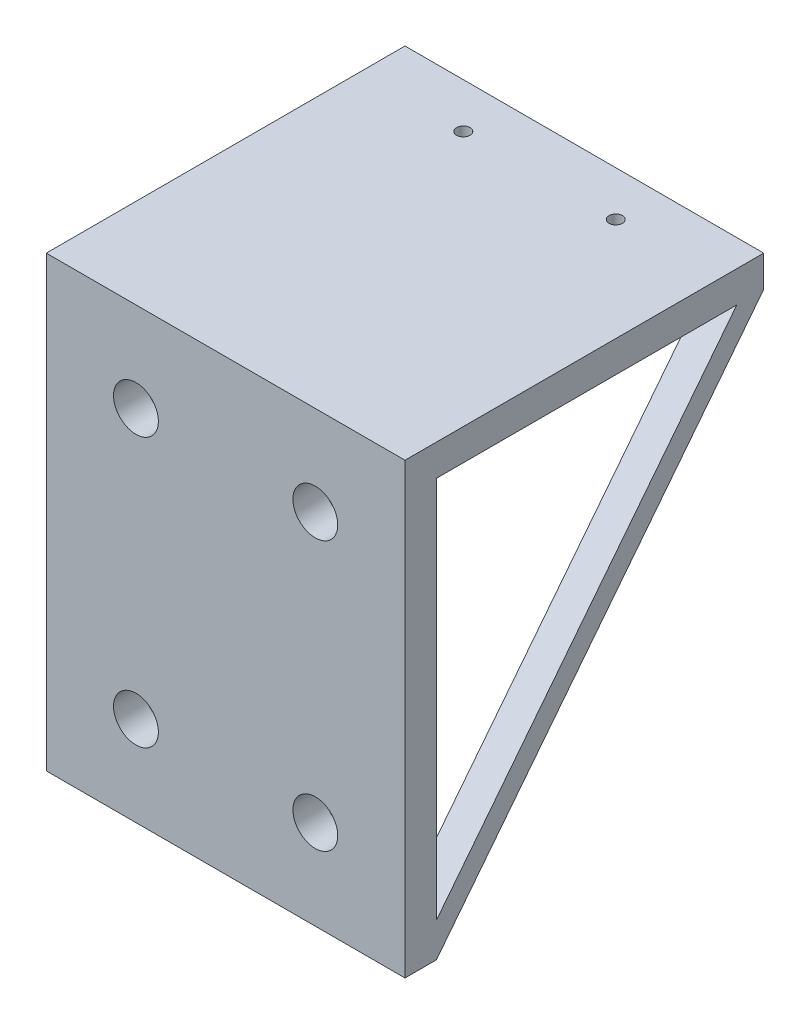
ISO-10303-21;
HEADER;
FILE_DESCRIPTION(('STEP AP214'),'2;1');
FILE_NAME('part.step','',(''),(''),'','','');
FILE_SCHEMA(('AUTOMOTIVE_DESIGN { 1 0 10303 214 1 1 1 1 }'));
ENDSEC;
DATA;
#1=APPLICATION_CONTEXT('core data for automotive mechanical design processes');
#2=APPLICATION_PROTOCOL_DEFINITION('international standard','automotive_design',2000,#1);
#3=PRODUCT_CONTEXT('',#1,'mechanical');
#4=PRODUCT('Part','Part','',(#3));
#5=PRODUCT_RELATED_PRODUCT_CATEGORY('part','',(#4));
#6=PRODUCT_DEFINITION_FORMATION('','',#4);
#7=PRODUCT_DEFINITION_CONTEXT('part definition',#1,'design');
#8=PRODUCT_DEFINITION('design','',#6,#7);
#9=PRODUCT_DEFINITION_SHAPE('','',#8);
#10=(LENGTH_UNIT() NAMED_UNIT(*) SI_UNIT(.MILLI.,.METRE.));
#11=(NAMED_UNIT(*) PLANE_ANGLE_UNIT() SI_UNIT($,.RADIAN.));
#12=(NAMED_UNIT(*) SI_UNIT($,.STERADIAN.) SOLID_ANGLE_UNIT());
#13=UNCERTAINTY_MEASURE_WITH_UNIT(LENGTH_MEASURE(1.E-05),#10,'distance_accuracy_value','');
#14=(GEOMETRIC_REPRESENTATION_CONTEXT(3) GLOBAL_UNCERTAINTY_ASSIGNED_CONTEXT((#13)) GLOBAL_UNIT_ASSIGNED_CONTEXT((#10,
#11,#12)) REPRESENTATION_CONTEXT('',''));
#15=CARTESIAN_POINT('',(0.,0.,0.));
#16=DIRECTION('',(0.,0.,1.));
#17=DIRECTION('',(1.,0.,0.));
#18=AXIS2_PLACEMENT_3D('',#15,#16,#17);
#19=CARTESIAN_POINT('',(0.,0.,0.));
#20=DIRECTION('',(0.,0.,1.));
#21=DIRECTION('',(1.,0.,0.));
#22=AXIS2_PLACEMENT_3D('',#19,#20,#21);
#23=PLANE('',#22);
#24=CARTESIAN_POINT('',(20.,30.,0.));
#25=DIRECTION('',(0.,0.,-1.));
#26=DIRECTION('',(-1.,0.,0.));
#27=AXIS2_PLACEMENT_3D('',#24,#25,#26);
#28=CIRCLE('',#27,5.);
#29=CARTESIAN_POINT('',(15.,30.,0.));
#30=VERTEX_POINT('',#29);
#31=EDGE_CURVE('E205',#30,#30,#28,.T.);
#32=ORIENTED_EDGE('',*,*,#31,.F.);
#33=EDGE_LOOP('',(#32));
#34=FACE_BOUND('',#33,.T.);
#35=CARTESIAN_POINT('',(-20.,30.,0.));
#36=DIRECTION('',(0.,0.,-1.));
#37=DIRECTION('',(1.,0.,0.));
#38=AXIS2_PLACEMENT_3D('',#35,#36,#37);
#39=CIRCLE('',#38,5.);
#40=CARTESIAN_POINT('',(-25.,30.,0.));
#41=VERTEX_POINT('',#40);
#42=EDGE_CURVE('E206',#41,#41,#39,.T.);
#43=ORIENTED_EDGE('',*,*,#42,.F.);
#44=EDGE_LOOP('',(#43));
#45=FACE_BOUND('',#44,.T.);
#46=CARTESIAN_POINT('',(-20.,-30.,0.));
#47=DIRECTION('',(0.,0.,-1.));
#48=DIRECTION('',(-1.,0.,0.));
#49=AXIS2_PLACEMENT_3D('',#46,#47,#48);
#50=CIRCLE('',#49,5.);
#51=CARTESIAN_POINT('',(-25.,-30.,0.));
#52=VERTEX_POINT('',#51);
#53=EDGE_CURVE('E212',#52,#52,#50,.T.);
#54=ORIENTED_EDGE('',*,*,#53,.F.);
#55=EDGE_LOOP('',(#54));
#56=FACE_BOUND('',#55,.T.);
#57=CARTESIAN_POINT('',(20.,-30.,0.));
#58=DIRECTION('',(0.,0.,-1.));
#59=DIRECTION('',(1.,0.,0.));
#60=AXIS2_PLACEMENT_3D('',#57,#58,#59);
#61=CIRCLE('',#60,5.);
#62=CARTESIAN_POINT('',(15.,-30.,0.));
#63=VERTEX_POINT('',#62);
#64=EDGE_CURVE('E199',#63,#63,#61,.T.);
#65=ORIENTED_EDGE('',*,*,#64,.F.);
#66=EDGE_LOOP('',(#65));
#67=FACE_BOUND('',#66,.T.);
#68=DIRECTION('',(1.,0.,0.));
#69=VECTOR('',#68,1.);
#70=CARTESIAN_POINT('',(0.,-42.3561643835616,0.));
#71=LINE('',#70,#69);
#72=CARTESIAN_POINT('',(-40.,-42.3561643835616,0.));
#73=VERTEX_POINT('',#72);
#74=CARTESIAN_POINT('',(-33.,-42.3561643835616,0.));
#75=VERTEX_POINT('',#74);
#76=EDGE_CURVE('E145',#73,#75,#71,.T.);
#77=ORIENTED_EDGE('',*,*,#76,.F.);
#78=DIRECTION('',(0.,-1.,0.));
#79=VECTOR('',#78,1.);
#80=CARTESIAN_POINT('',(-40.,-50.,0.));
#81=LINE('',#80,#79);
#82=CARTESIAN_POINT('',(-40.,43.,0.));
#83=VERTEX_POINT('',#82);
#84=EDGE_CURVE('E223',#83,#73,#81,.T.);
#85=ORIENTED_EDGE('',*,*,#84,.F.);
#86=DIRECTION('',(1.,0.,0.));
#87=VECTOR('',#86,1.);
#88=CARTESIAN_POINT('',(0.,43.,0.));
#89=LINE('',#88,#87);
#90=CARTESIAN_POINT('',(40.,43.,0.));
#91=VERTEX_POINT('',#90);
#92=EDGE_CURVE('E11',#83,#91,#89,.T.);
#93=ORIENTED_EDGE('',*,*,#92,.T.);
#94=DIRECTION('',(0.,1.,0.));
#95=VECTOR('',#94,1.);
#96=CARTESIAN_POINT('',(40.,-50.,0.));
#97=LINE('',#96,#95);
#98=CARTESIAN_POINT('',(40.,-42.3561643835616,0.));
#99=VERTEX_POINT('',#98);
#100=EDGE_CURVE('E229',#99,#91,#97,.T.);
#101=ORIENTED_EDGE('',*,*,#100,.F.);
#102=DIRECTION('',(-1.,0.,0.));
#103=VECTOR('',#102,1.);
#104=CARTESIAN_POINT('',(0.,-42.3561643835616,0.));
#105=LINE('',#104,#103);
#106=CARTESIAN_POINT('',(33.,-42.3561643835616,0.));
#107=VERTEX_POINT('',#106);
#108=EDGE_CURVE('E182',#99,#107,#105,.T.);
#109=ORIENTED_EDGE('',*,*,#108,.T.);
#110=DIRECTION('',(0.,-1.,0.));
#111=VECTOR('',#110,1.);
#112=CARTESIAN_POINT('',(33.,0.,0.));
#113=LINE('',#112,#111);
#114=CARTESIAN_POINT('',(33.,-50.,0.));
#115=VERTEX_POINT('',#114);
#116=EDGE_CURVE('E177',#107,#115,#113,.T.);
#117=ORIENTED_EDGE('',*,*,#116,.T.);
#118=DIRECTION('',(1.,0.,0.));
#119=VECTOR('',#118,1.);
#120=CARTESIAN_POINT('',(40.,-50.,0.));
#121=LINE('',#120,#119);
#122=CARTESIAN_POINT('',(-33.,-50.,0.));
#123=VERTEX_POINT('',#122);
#124=EDGE_CURVE('E238',#123,#115,#121,.T.);
#125=ORIENTED_EDGE('',*,*,#124,.F.);
#126=DIRECTION('',(0.,1.,0.));
#127=VECTOR('',#126,1.);
#128=CARTESIAN_POINT('',(-33.,0.,0.));
#129=LINE('',#128,#127);
#130=EDGE_CURVE('E155',#123,#75,#129,.T.);
#131=ORIENTED_EDGE('',*,*,#130,.T.);
#132=EDGE_LOOP('',(#77,#85,#93,#101,#109,#117,#125,#131));
#133=FACE_BOUND('',#132,.T.);
#134=ADVANCED_FACE('F37',(#34,#45,#56,#67,#133),#23,.F.);
#135=CARTESIAN_POINT('',(0.,43.,0.));
#136=DIRECTION('',(0.,-1.,0.));
#137=DIRECTION('',(1.,0.,0.));
#138=AXIS2_PLACEMENT_3D('',#135,#136,#137);
#139=PLANE('',#138);
#140=CARTESIAN_POINT('',(-17.,43.,-63.));
#141=DIRECTION('',(0.,1.,0.));
#142=DIRECTION('',(-1.,0.,0.));
#143=AXIS2_PLACEMENT_3D('',#140,#141,#142);
#144=CIRCLE('',#143,1.5);
#145=CARTESIAN_POINT('',(-18.5,43.,-63.));
#146=VERTEX_POINT('',#145);
#147=EDGE_CURVE('E261',#146,#146,#144,.T.);
#148=ORIENTED_EDGE('',*,*,#147,.T.);
#149=EDGE_LOOP('',(#148));
#150=FACE_BOUND('',#149,.T.);
#151=CARTESIAN_POINT('',(17.,43.,-63.));
#152=DIRECTION('',(0.,1.,0.));
#153=DIRECTION('',(-1.,0.,0.));
#154=AXIS2_PLACEMENT_3D('',#151,#152,#153);
#155=CIRCLE('',#154,1.5);
#156=CARTESIAN_POINT('',(15.5,43.,-63.));
#157=VERTEX_POINT('',#156);
#158=EDGE_CURVE('E267',#157,#157,#155,.T.);
#159=ORIENTED_EDGE('',*,*,#158,.T.);
#160=EDGE_LOOP('',(#159));
#161=FACE_BOUND('',#160,.T.);
#162=DIRECTION('',(0.,0.,1.));
#163=VECTOR('',#162,1.);
#164=CARTESIAN_POINT('',(-40.,43.,7.));
#165=LINE('',#164,#163);
#166=CARTESIAN_POINT('',(-40.,43.,-67.));
#167=VERTEX_POINT('',#166);
#168=EDGE_CURVE('E151',#167,#83,#165,.T.);
#169=ORIENTED_EDGE('',*,*,#168,.F.);
#170=DIRECTION('',(-1.,0.,0.));
#171=VECTOR('',#170,1.);
#172=CARTESIAN_POINT('',(-33.,43.,-67.));
#173=LINE('',#172,#171);
#174=CARTESIAN_POINT('',(-33.,43.,-67.));
#175=VERTEX_POINT('',#174);
#176=EDGE_CURVE('E142',#175,#167,#173,.T.);
#177=ORIENTED_EDGE('',*,*,#176,.F.);
#178=DIRECTION('',(0.,0.,1.));
#179=VECTOR('',#178,1.);
#180=CARTESIAN_POINT('',(-33.,43.,-73.));
#181=LINE('',#180,#179);
#182=CARTESIAN_POINT('',(-33.,43.,-73.));
#183=VERTEX_POINT('',#182);
#184=EDGE_CURVE('E127',#183,#175,#181,.T.);
#185=ORIENTED_EDGE('',*,*,#184,.F.);
#186=DIRECTION('',(-1.,0.,0.));
#187=VECTOR('',#186,1.);
#188=CARTESIAN_POINT('',(-40.,43.,-73.));
#189=LINE('',#188,#187);
#190=CARTESIAN_POINT('',(33.,43.,-73.));
#191=VERTEX_POINT('',#190);
#192=EDGE_CURVE('E189',#191,#183,#189,.T.);
#193=ORIENTED_EDGE('',*,*,#192,.F.);
#194=DIRECTION('',(0.,0.,1.));
#195=VECTOR('',#194,1.);
#196=CARTESIAN_POINT('',(33.,43.,-73.));
#197=LINE('',#196,#195);
#198=CARTESIAN_POINT('',(33.,43.,-67.));
#199=VERTEX_POINT('',#198);
#200=EDGE_CURVE('E164',#191,#199,#197,.T.);
#201=ORIENTED_EDGE('',*,*,#200,.T.);
#202=DIRECTION('',(1.,0.,0.));
#203=VECTOR('',#202,1.);
#204=CARTESIAN_POINT('',(33.,43.,-67.));
#205=LINE('',#204,#203);
#206=CARTESIAN_POINT('',(40.,43.,-67.));
#207=VERTEX_POINT('',#206);
#208=EDGE_CURVE('E174',#199,#207,#205,.T.);
#209=ORIENTED_EDGE('',*,*,#208,.T.);
#210=DIRECTION('',(0.,0.,-1.));
#211=VECTOR('',#210,1.);
#212=CARTESIAN_POINT('',(40.,43.,7.));
#213=LINE('',#212,#211);
#214=EDGE_CURVE('E187',#91,#207,#213,.T.);
#215=ORIENTED_EDGE('',*,*,#214,.F.);
#216=ORIENTED_EDGE('',*,*,#92,.F.);
#217=EDGE_LOOP('',(#169,#177,#185,#193,#201,#209,#215,#216));
#218=FACE_BOUND('',#217,.T.);
#219=ADVANCED_FACE('F149',(#150,#161,#218),#139,.T.);
#220=CARTESIAN_POINT('',(-40.,-50.,7.));
#221=DIRECTION('',(1.,0.,0.));
#222=DIRECTION('',(0.,0.,-1.));
#223=AXIS2_PLACEMENT_3D('',#220,#221,#222);
#224=PLANE('',#223);
#225=ORIENTED_EDGE('',*,*,#84,.T.);
#226=DIRECTION('',(0.,-0.786611751985509,0.617447934354217));
#227=VECTOR('',#226,1.);
#228=CARTESIAN_POINT('',(-40.,-50.,6.));
#229=LINE('',#228,#227);
#230=EDGE_CURVE('E260',#167,#73,#229,.T.);
#231=ORIENTED_EDGE('',*,*,#230,.F.);
#232=ORIENTED_EDGE('',*,*,#168,.T.);
#233=EDGE_LOOP('',(#225,#231,#232));
#234=FACE_BOUND('',#233,.T.);
#235=DIRECTION('',(0.,0.786611751985509,-0.617447934354217));
#236=VECTOR('',#235,1.);
#237=CARTESIAN_POINT('',(-40.,-50.,0.));
#238=LINE('',#237,#236);
#239=CARTESIAN_POINT('',(-40.,-50.,0.));
#240=VERTEX_POINT('',#239);
#241=CARTESIAN_POINT('',(-40.,43.,-73.));
#242=VERTEX_POINT('',#241);
#243=EDGE_CURVE('E146',#240,#242,#238,.T.);
#244=ORIENTED_EDGE('',*,*,#243,.F.);
#245=DIRECTION('',(0.,0.,-1.));
#246=VECTOR('',#245,1.);
#247=CARTESIAN_POINT('',(-40.,-50.,7.));
#248=LINE('',#247,#246);
#249=CARTESIAN_POINT('',(-40.,-50.,7.));
#250=VERTEX_POINT('',#249);
#251=EDGE_CURVE('E45',#250,#240,#248,.T.);
#252=ORIENTED_EDGE('',*,*,#251,.F.);
#253=DIRECTION('',(0.,-1.,0.));
#254=VECTOR('',#253,1.);
#255=CARTESIAN_POINT('',(-40.,-50.,7.));
#256=LINE('',#255,#254);
#257=CARTESIAN_POINT('',(-40.,50.,7.));
#258=VERTEX_POINT('',#257);
#259=EDGE_CURVE('E226',#258,#250,#256,.T.);
#260=ORIENTED_EDGE('',*,*,#259,.F.);
#261=DIRECTION('',(0.,0.,-1.));
#262=VECTOR('',#261,1.);
#263=CARTESIAN_POINT('',(-40.,50.,7.));
#264=LINE('',#263,#262);
#265=CARTESIAN_POINT('',(-40.,50.,-73.));
#266=VERTEX_POINT('',#265);
#267=EDGE_CURVE('E235',#258,#266,#264,.T.);
#268=ORIENTED_EDGE('',*,*,#267,.T.);
#269=DIRECTION('',(0.,1.,0.));
#270=VECTOR('',#269,1.);
#271=CARTESIAN_POINT('',(-40.,43.,-73.));
#272=LINE('',#271,#270);
#273=EDGE_CURVE('E196',#242,#266,#272,.T.);
#274=ORIENTED_EDGE('',*,*,#273,.F.);
#275=EDGE_LOOP('',(#244,#252,#260,#268,#274));
#276=FACE_BOUND('',#275,.T.);
#277=ADVANCED_FACE('F39',(#234,#276),#224,.F.);
#278=CARTESIAN_POINT('',(40.,-50.,7.));
#279=DIRECTION('',(0.,1.,0.));
#280=DIRECTION('',(-1.,0.,0.));
#281=AXIS2_PLACEMENT_3D('',#278,#279,#280);
#282=PLANE('',#281);
#283=ORIENTED_EDGE('',*,*,#251,.T.);
#284=EDGE_CURVE('E239',#240,#123,#121,.T.);
#285=ORIENTED_EDGE('',*,*,#284,.T.);
#286=ORIENTED_EDGE('',*,*,#124,.T.);
#287=DIRECTION('',(1.,0.,0.));
#288=VECTOR('',#287,1.);
#289=CARTESIAN_POINT('',(33.,-50.,0.));
#290=LINE('',#289,#288);
#291=CARTESIAN_POINT('',(40.,-50.,0.));
#292=VERTEX_POINT('',#291);
#293=EDGE_CURVE('E170',#115,#292,#290,.T.);
#294=ORIENTED_EDGE('',*,*,#293,.T.);
#295=DIRECTION('',(0.,0.,-1.));
#296=VECTOR('',#295,1.);
#297=CARTESIAN_POINT('',(40.,-50.,7.));
#298=LINE('',#297,#296);
#299=CARTESIAN_POINT('',(40.,-50.,7.));
#300=VERTEX_POINT('',#299);
#301=EDGE_CURVE('E246',#300,#292,#298,.T.);
#302=ORIENTED_EDGE('',*,*,#301,.F.);
#303=DIRECTION('',(1.,0.,0.));
#304=VECTOR('',#303,1.);
#305=CARTESIAN_POINT('',(40.,-50.,7.));
#306=LINE('',#305,#304);
#307=EDGE_CURVE('E228',#250,#300,#306,.T.);
#308=ORIENTED_EDGE('',*,*,#307,.F.);
#309=EDGE_LOOP('',(#283,#285,#286,#294,#302,#308));
#310=FACE_BOUND('',#309,.T.);
#311=ADVANCED_FACE('F251',(#310),#282,.F.);
#312=CARTESIAN_POINT('',(40.,-50.,7.));
#313=DIRECTION('',(-1.,0.,0.));
#314=DIRECTION('',(0.,0.,1.));
#315=AXIS2_PLACEMENT_3D('',#312,#313,#314);
#316=PLANE('',#315);
#317=DIRECTION('',(0.,-0.786611751985509,0.617447934354217));
#318=VECTOR('',#317,1.);
#319=CARTESIAN_POINT('',(40.,-50.,6.));
#320=LINE('',#319,#318);
#321=EDGE_CURVE('E52',#207,#99,#320,.T.);
#322=ORIENTED_EDGE('',*,*,#321,.T.);
#323=ORIENTED_EDGE('',*,*,#100,.T.);
#324=ORIENTED_EDGE('',*,*,#214,.T.);
#325=EDGE_LOOP('',(#322,#323,#324));
#326=FACE_BOUND('',#325,.T.);
#327=ORIENTED_EDGE('',*,*,#301,.T.);
#328=DIRECTION('',(0.,0.786611751985509,-0.617447934354217));
#329=VECTOR('',#328,1.);
#330=CARTESIAN_POINT('',(40.,-50.,0.));
#331=LINE('',#330,#329);
#332=CARTESIAN_POINT('',(40.,43.,-73.));
#333=VERTEX_POINT('',#332);
#334=EDGE_CURVE('E162',#292,#333,#331,.T.);
#335=ORIENTED_EDGE('',*,*,#334,.T.);
#336=DIRECTION('',(0.,1.,0.));
#337=VECTOR('',#336,1.);
#338=CARTESIAN_POINT('',(40.,43.,-73.));
#339=LINE('',#338,#337);
#340=CARTESIAN_POINT('',(40.,50.,-73.));
#341=VERTEX_POINT('',#340);
#342=EDGE_CURVE('E193',#333,#341,#339,.T.);
#343=ORIENTED_EDGE('',*,*,#342,.T.);
#344=DIRECTION('',(0.,0.,-1.));
#345=VECTOR('',#344,1.);
#346=CARTESIAN_POINT('',(40.,50.,7.));
#347=LINE('',#346,#345);
#348=CARTESIAN_POINT('',(40.,50.,7.));
#349=VERTEX_POINT('',#348);
#350=EDGE_CURVE('E244',#349,#341,#347,.T.);
#351=ORIENTED_EDGE('',*,*,#350,.F.);
#352=DIRECTION('',(0.,1.,0.));
#353=VECTOR('',#352,1.);
#354=CARTESIAN_POINT('',(40.,-50.,7.));
#355=LINE('',#354,#353);
#356=EDGE_CURVE('E231',#300,#349,#355,.T.);
#357=ORIENTED_EDGE('',*,*,#356,.F.);
#358=EDGE_LOOP('',(#327,#335,#343,#351,#357));
#359=FACE_BOUND('',#358,.T.);
#360=ADVANCED_FACE('F289',(#326,#359),#316,.F.);
#361=CARTESIAN_POINT('',(40.,50.,7.));
#362=DIRECTION('',(0.,-1.,0.));
#363=DIRECTION('',(1.,0.,0.));
#364=AXIS2_PLACEMENT_3D('',#361,#362,#363);
#365=PLANE('',#364);
#366=CARTESIAN_POINT('',(-17.,50.,-63.));
#367=DIRECTION('',(0.,1.,0.));
#368=DIRECTION('',(-1.,0.,0.));
#369=AXIS2_PLACEMENT_3D('',#366,#367,#368);
#370=CIRCLE('',#369,1.5);
#371=CARTESIAN_POINT('',(-18.5,50.,-63.));
#372=VERTEX_POINT('',#371);
#373=EDGE_CURVE('E270',#372,#372,#370,.T.);
#374=ORIENTED_EDGE('',*,*,#373,.F.);
#375=EDGE_LOOP('',(#374));
#376=FACE_BOUND('',#375,.T.);
#377=CARTESIAN_POINT('',(17.,50.,-63.));
#378=DIRECTION('',(0.,1.,0.));
#379=DIRECTION('',(-1.,0.,0.));
#380=AXIS2_PLACEMENT_3D('',#377,#378,#379);
#381=CIRCLE('',#380,1.5);
#382=CARTESIAN_POINT('',(15.5,50.,-63.));
#383=VERTEX_POINT('',#382);
#384=EDGE_CURVE('E264',#383,#383,#381,.T.);
#385=ORIENTED_EDGE('',*,*,#384,.F.);
#386=EDGE_LOOP('',(#385));
#387=FACE_BOUND('',#386,.T.);
#388=ORIENTED_EDGE('',*,*,#350,.T.);
#389=DIRECTION('',(-1.,0.,0.));
#390=VECTOR('',#389,1.);
#391=CARTESIAN_POINT('',(-40.,50.,-73.));
#392=LINE('',#391,#390);
#393=EDGE_CURVE('E185',#341,#266,#392,.T.);
#394=ORIENTED_EDGE('',*,*,#393,.T.);
#395=ORIENTED_EDGE('',*,*,#267,.F.);
#396=DIRECTION('',(-1.,0.,0.));
#397=VECTOR('',#396,1.);
#398=CARTESIAN_POINT('',(40.,50.,7.));
#399=LINE('',#398,#397);
#400=EDGE_CURVE('E233',#349,#258,#399,.T.);
#401=ORIENTED_EDGE('',*,*,#400,.F.);
#402=EDGE_LOOP('',(#388,#394,#395,#401));
#403=FACE_BOUND('',#402,.T.);
#404=ADVANCED_FACE('F285',(#376,#387,#403),#365,.F.);
#405=CARTESIAN_POINT('',(0.,0.,7.));
#406=DIRECTION('',(0.,0.,1.));
#407=DIRECTION('',(1.,0.,0.));
#408=AXIS2_PLACEMENT_3D('',#405,#406,#407);
#409=PLANE('',#408);
#410=ORIENTED_EDGE('',*,*,#356,.T.);
#411=ORIENTED_EDGE('',*,*,#400,.T.);
#412=ORIENTED_EDGE('',*,*,#259,.T.);
#413=ORIENTED_EDGE('',*,*,#307,.T.);
#414=EDGE_LOOP('',(#410,#411,#412,#413));
#415=FACE_BOUND('',#414,.T.);
#416=CARTESIAN_POINT('',(20.,-30.,7.));
#417=DIRECTION('',(0.,0.,-1.));
#418=DIRECTION('',(1.,0.,0.));
#419=AXIS2_PLACEMENT_3D('',#416,#417,#418);
#420=CIRCLE('',#419,5.);
#421=CARTESIAN_POINT('',(15.,-30.,7.));
#422=VERTEX_POINT('',#421);
#423=EDGE_CURVE('E215',#422,#422,#420,.T.);
#424=ORIENTED_EDGE('',*,*,#423,.T.);
#425=EDGE_LOOP('',(#424));
#426=FACE_BOUND('',#425,.T.);
#427=CARTESIAN_POINT('',(-20.,-30.,7.));
#428=DIRECTION('',(0.,0.,-1.));
#429=DIRECTION('',(-1.,0.,0.));
#430=AXIS2_PLACEMENT_3D('',#427,#428,#429);
#431=CIRCLE('',#430,5.);
#432=CARTESIAN_POINT('',(-25.,-30.,7.));
#433=VERTEX_POINT('',#432);
#434=EDGE_CURVE('E209',#433,#433,#431,.T.);
#435=ORIENTED_EDGE('',*,*,#434,.T.);
#436=EDGE_LOOP('',(#435));
#437=FACE_BOUND('',#436,.T.);
#438=CARTESIAN_POINT('',(-20.,30.,7.));
#439=DIRECTION('',(0.,0.,-1.));
#440=DIRECTION('',(1.,0.,0.));
#441=AXIS2_PLACEMENT_3D('',#438,#439,#440);
#442=CIRCLE('',#441,5.);
#443=CARTESIAN_POINT('',(-25.,30.,7.));
#444=VERTEX_POINT('',#443);
#445=EDGE_CURVE('E202',#444,#444,#442,.T.);
#446=ORIENTED_EDGE('',*,*,#445,.T.);
#447=EDGE_LOOP('',(#446));
#448=FACE_BOUND('',#447,.T.);
#449=CARTESIAN_POINT('',(20.,30.,7.));
#450=DIRECTION('',(0.,0.,-1.));
#451=DIRECTION('',(-1.,0.,0.));
#452=AXIS2_PLACEMENT_3D('',#449,#450,#451);
#453=CIRCLE('',#452,5.);
#454=CARTESIAN_POINT('',(15.,30.,7.));
#455=VERTEX_POINT('',#454);
#456=EDGE_CURVE('E220',#455,#455,#453,.T.);
#457=ORIENTED_EDGE('',*,*,#456,.T.);
#458=EDGE_LOOP('',(#457));
#459=FACE_BOUND('',#458,.T.);
#460=ADVANCED_FACE('F288',(#415,#426,#437,#448,#459),#409,.T.);
#461=CARTESIAN_POINT('',(20.,30.,7.));
#462=DIRECTION('',(0.,0.,-1.));
#463=DIRECTION('',(-1.,0.,0.));
#464=AXIS2_PLACEMENT_3D('',#461,#462,#463);
#465=CYLINDRICAL_SURFACE('',#464,5.);
#466=CARTESIAN_POINT('',(15.,30.,7.));
#467=CARTESIAN_POINT('',(15.,30.,6.92708333333333));
#468=CARTESIAN_POINT('',(15.,30.,6.85416666666667));
#469=CARTESIAN_POINT('',(15.,30.,6.70833333333333));
#470=CARTESIAN_POINT('',(15.,30.,6.63541666666667));
#471=CARTESIAN_POINT('',(15.,30.,6.48958333333333));
#472=CARTESIAN_POINT('',(15.,30.,6.41666666666667));
#473=CARTESIAN_POINT('',(15.,30.,6.27083333333333));
#474=CARTESIAN_POINT('',(15.,30.,6.19791666666667));
#475=CARTESIAN_POINT('',(15.,30.,6.05208333333333));
#476=CARTESIAN_POINT('',(15.,30.,5.97916666666667));
#477=CARTESIAN_POINT('',(15.,30.,5.83333333333333));
#478=CARTESIAN_POINT('',(15.,30.,5.76041666666667));
#479=CARTESIAN_POINT('',(15.,30.,5.61458333333333));
#480=CARTESIAN_POINT('',(15.,30.,5.54166666666667));
#481=CARTESIAN_POINT('',(15.,30.,5.39583333333333));
#482=CARTESIAN_POINT('',(15.,30.,5.32291666666667));
#483=CARTESIAN_POINT('',(15.,30.,5.17708333333333));
#484=CARTESIAN_POINT('',(15.,30.,5.10416666666667));
#485=CARTESIAN_POINT('',(15.,30.,4.95833333333333));
#486=CARTESIAN_POINT('',(15.,30.,4.88541666666667));
#487=CARTESIAN_POINT('',(15.,30.,4.73958333333333));
#488=CARTESIAN_POINT('',(15.,30.,4.66666666666667));
#489=CARTESIAN_POINT('',(15.,30.,4.52083333333333));
#490=CARTESIAN_POINT('',(15.,30.,4.44791666666667));
#491=CARTESIAN_POINT('',(15.,30.,4.30208333333333));
#492=CARTESIAN_POINT('',(15.,30.,4.22916666666667));
#493=CARTESIAN_POINT('',(15.,30.,4.08333333333333));
#494=CARTESIAN_POINT('',(15.,30.,4.01041666666667));
#495=CARTESIAN_POINT('',(15.,30.,3.86458333333333));
#496=CARTESIAN_POINT('',(15.,30.,3.79166666666667));
#497=CARTESIAN_POINT('',(15.,30.,3.64583333333333));
#498=CARTESIAN_POINT('',(15.,30.,3.57291666666667));
#499=CARTESIAN_POINT('',(15.,30.,3.42708333333333));
#500=CARTESIAN_POINT('',(15.,30.,3.35416666666667));
#501=CARTESIAN_POINT('',(15.,30.,3.20833333333333));
#502=CARTESIAN_POINT('',(15.,30.,3.13541666666667));
#503=CARTESIAN_POINT('',(15.,30.,2.98958333333333));
#504=CARTESIAN_POINT('',(15.,30.,2.91666666666667));
#505=CARTESIAN_POINT('',(15.,30.,2.77083333333333));
#506=CARTESIAN_POINT('',(15.,30.,2.69791666666667));
#507=CARTESIAN_POINT('',(15.,30.,2.55208333333333));
#508=CARTESIAN_POINT('',(15.,30.,2.47916666666667));
#509=CARTESIAN_POINT('',(15.,30.,2.33333333333333));
#510=CARTESIAN_POINT('',(15.,30.,2.26041666666667));
#511=CARTESIAN_POINT('',(15.,30.,2.11458333333333));
#512=CARTESIAN_POINT('',(15.,30.,2.04166666666667));
#513=CARTESIAN_POINT('',(15.,30.,1.89583333333333));
#514=CARTESIAN_POINT('',(15.,30.,1.82291666666667));
#515=CARTESIAN_POINT('',(15.,30.,1.67708333333333));
#516=CARTESIAN_POINT('',(15.,30.,1.60416666666667));
#517=CARTESIAN_POINT('',(15.,30.,1.45833333333333));
#518=CARTESIAN_POINT('',(15.,30.,1.38541666666667));
#519=CARTESIAN_POINT('',(15.,30.,1.23958333333333));
#520=CARTESIAN_POINT('',(15.,30.,1.16666666666667));
#521=CARTESIAN_POINT('',(15.,30.,1.02083333333333));
#522=CARTESIAN_POINT('',(15.,30.,0.947916666666668));
#523=CARTESIAN_POINT('',(15.,30.,0.802083333333334));
#524=CARTESIAN_POINT('',(15.,30.,0.729166666666667));
#525=CARTESIAN_POINT('',(15.,30.,0.583333333333334));
#526=CARTESIAN_POINT('',(15.,30.,0.510416666666668));
#527=CARTESIAN_POINT('',(15.,30.,0.364583333333335));
#528=CARTESIAN_POINT('',(15.,30.,0.291666666666668));
#529=CARTESIAN_POINT('',(15.,30.,0.145833333333334));
#530=CARTESIAN_POINT('',(15.,30.,0.0729166666666675));
#531=CARTESIAN_POINT('',(15.,30.,0.));
#532=B_SPLINE_CURVE_WITH_KNOTS('',3,(#466,#467,#468,#469,#470,#471,#472,#473,#474,#475,#476,
#477,#478,#479,#480,#481,#482,#483,#484,#485,#486,#487,#488,#489,#490,#491,#492,#493,#494,#495,
#496,#497,#498,#499,#500,#501,#502,#503,#504,#505,#506,#507,#508,#509,#510,#511,#512,#513,#514,
#515,#516,#517,#518,#519,#520,#521,#522,#523,#524,#525,#526,#527,#528,#529,#530,#531),
.UNSPECIFIED.,.F.,.F.,(4,2,2,2,2,2,2,2,2,2,2,2,2,2,2,2,2,2,2,2,2,2,2,2,2,2,2,2,2,2,2,2,4),(0.,
0.21875,0.4375,0.656250000000001,0.875,1.09375,1.3125,1.53125,1.75,1.96875,2.1875,2.40625,2.625,
2.84375,3.0625,3.28125,3.5,3.71875,3.9375,4.15625,4.375,4.59375,4.8125,5.03125,5.25,5.46875,
5.6875,5.90625,6.125,6.34375,6.5625,6.78125,7.),.UNSPECIFIED.);
#533=EDGE_CURVE('BSEAM347',#455,#30,#532,.T.);
#534=ORIENTED_EDGE('',*,*,#456,.F.);
#535=ORIENTED_EDGE('',*,*,#31,.T.);
#536=ORIENTED_EDGE('',*,*,#533,.T.);
#537=ORIENTED_EDGE('',*,*,#533,.F.);
#538=EDGE_LOOP('',(#534,#536,#535,#537));
#539=FACE_BOUND('',#538,.T.);
#540=ADVANCED_FACE('F347',(#539),#465,.F.);
#541=CARTESIAN_POINT('',(-20.,30.,7.));
#542=DIRECTION('',(0.,0.,-1.));
#543=DIRECTION('',(-1.,0.,0.));
#544=AXIS2_PLACEMENT_3D('',#541,#542,#543);
#545=CYLINDRICAL_SURFACE('',#544,5.);
#546=CARTESIAN_POINT('',(-25.,30.,7.));
#547=CARTESIAN_POINT('',(-25.,30.,6.92708333333333));
#548=CARTESIAN_POINT('',(-25.,30.,6.85416666666667));
#549=CARTESIAN_POINT('',(-25.,30.,6.70833333333333));
#550=CARTESIAN_POINT('',(-25.,30.,6.63541666666667));
#551=CARTESIAN_POINT('',(-25.,30.,6.48958333333333));
#552=CARTESIAN_POINT('',(-25.,30.,6.41666666666667));
#553=CARTESIAN_POINT('',(-25.,30.,6.27083333333333));
#554=CARTESIAN_POINT('',(-25.,30.,6.19791666666667));
#555=CARTESIAN_POINT('',(-25.,30.,6.05208333333333));
#556=CARTESIAN_POINT('',(-25.,30.,5.97916666666667));
#557=CARTESIAN_POINT('',(-25.,30.,5.83333333333333));
#558=CARTESIAN_POINT('',(-25.,30.,5.76041666666667));
#559=CARTESIAN_POINT('',(-25.,30.,5.61458333333333));
#560=CARTESIAN_POINT('',(-25.,30.,5.54166666666667));
#561=CARTESIAN_POINT('',(-25.,30.,5.39583333333333));
#562=CARTESIAN_POINT('',(-25.,30.,5.32291666666667));
#563=CARTESIAN_POINT('',(-25.,30.,5.17708333333333));
#564=CARTESIAN_POINT('',(-25.,30.,5.10416666666667));
#565=CARTESIAN_POINT('',(-25.,30.,4.95833333333333));
#566=CARTESIAN_POINT('',(-25.,30.,4.88541666666667));
#567=CARTESIAN_POINT('',(-25.,30.,4.73958333333333));
#568=CARTESIAN_POINT('',(-25.,30.,4.66666666666667));
#569=CARTESIAN_POINT('',(-25.,30.,4.52083333333333));
#570=CARTESIAN_POINT('',(-25.,30.,4.44791666666667));
#571=CARTESIAN_POINT('',(-25.,30.,4.30208333333333));
#572=CARTESIAN_POINT('',(-25.,30.,4.22916666666667));
#573=CARTESIAN_POINT('',(-25.,30.,4.08333333333333));
#574=CARTESIAN_POINT('',(-25.,30.,4.01041666666667));
#575=CARTESIAN_POINT('',(-25.,30.,3.86458333333333));
#576=CARTESIAN_POINT('',(-25.,30.,3.79166666666667));
#577=CARTESIAN_POINT('',(-25.,30.,3.64583333333333));
#578=CARTESIAN_POINT('',(-25.,30.,3.57291666666667));
#579=CARTESIAN_POINT('',(-25.,30.,3.42708333333333));
#580=CARTESIAN_POINT('',(-25.,30.,3.35416666666667));
#581=CARTESIAN_POINT('',(-25.,30.,3.20833333333333));
#582=CARTESIAN_POINT('',(-25.,30.,3.13541666666667));
#583=CARTESIAN_POINT('',(-25.,30.,2.98958333333333));
#584=CARTESIAN_POINT('',(-25.,30.,2.91666666666667));
#585=CARTESIAN_POINT('',(-25.,30.,2.77083333333333));
#586=CARTESIAN_POINT('',(-25.,30.,2.69791666666667));
#587=CARTESIAN_POINT('',(-25.,30.,2.55208333333333));
#588=CARTESIAN_POINT('',(-25.,30.,2.47916666666667));
#589=CARTESIAN_POINT('',(-25.,30.,2.33333333333333));
#590=CARTESIAN_POINT('',(-25.,30.,2.26041666666667));
#591=CARTESIAN_POINT('',(-25.,30.,2.11458333333333));
#592=CARTESIAN_POINT('',(-25.,30.,2.04166666666667));
#593=CARTESIAN_POINT('',(-25.,30.,1.89583333333333));
#594=CARTESIAN_POINT('',(-25.,30.,1.82291666666667));
#595=CARTESIAN_POINT('',(-25.,30.,1.67708333333333));
#596=CARTESIAN_POINT('',(-25.,30.,1.60416666666667));
#597=CARTESIAN_POINT('',(-25.,30.,1.45833333333333));
#598=CARTESIAN_POINT('',(-25.,30.,1.38541666666667));
#599=CARTESIAN_POINT('',(-25.,30.,1.23958333333333));
#600=CARTESIAN_POINT('',(-25.,30.,1.16666666666667));
#601=CARTESIAN_POINT('',(-25.,30.,1.02083333333333));
#602=CARTESIAN_POINT('',(-25.,30.,0.947916666666668));
#603=CARTESIAN_POINT('',(-25.,30.,0.802083333333334));
#604=CARTESIAN_POINT('',(-25.,30.,0.729166666666667));
#605=CARTESIAN_POINT('',(-25.,30.,0.583333333333334));
#606=CARTESIAN_POINT('',(-25.,30.,0.510416666666668));
#607=CARTESIAN_POINT('',(-25.,30.,0.364583333333335));
#608=CARTESIAN_POINT('',(-25.,30.,0.291666666666668));
#609=CARTESIAN_POINT('',(-25.,30.,0.145833333333334));
#610=CARTESIAN_POINT('',(-25.,30.,0.0729166666666675));
#611=CARTESIAN_POINT('',(-25.,30.,0.));
#612=B_SPLINE_CURVE_WITH_KNOTS('',3,(#546,#547,#548,#549,#550,#551,#552,#553,#554,#555,#556,
#557,#558,#559,#560,#561,#562,#563,#564,#565,#566,#567,#568,#569,#570,#571,#572,#573,#574,#575,
#576,#577,#578,#579,#580,#581,#582,#583,#584,#585,#586,#587,#588,#589,#590,#591,#592,#593,#594,
#595,#596,#597,#598,#599,#600,#601,#602,#603,#604,#605,#606,#607,#608,#609,#610,#611),
.UNSPECIFIED.,.F.,.F.,(4,2,2,2,2,2,2,2,2,2,2,2,2,2,2,2,2,2,2,2,2,2,2,2,2,2,2,2,2,2,2,2,4),(0.,
0.21875,0.4375,0.656250000000001,0.875,1.09375,1.3125,1.53125,1.75,1.96875,2.1875,2.40625,2.625,
2.84375,3.0625,3.28125,3.5,3.71875,3.9375,4.15625,4.375,4.59375,4.8125,5.03125,5.25,5.46875,
5.6875,5.90625,6.125,6.34375,6.5625,6.78125,7.),.UNSPECIFIED.);
#613=EDGE_CURVE('BSEAM355',#444,#41,#612,.T.);
#614=ORIENTED_EDGE('',*,*,#445,.F.);
#615=ORIENTED_EDGE('',*,*,#42,.T.);
#616=ORIENTED_EDGE('',*,*,#613,.T.);
#617=ORIENTED_EDGE('',*,*,#613,.F.);
#618=EDGE_LOOP('',(#614,#616,#615,#617));
#619=FACE_BOUND('',#618,.T.);
#620=ADVANCED_FACE('F355',(#619),#545,.F.);
#621=CARTESIAN_POINT('',(-20.,-30.,7.));
#622=DIRECTION('',(0.,0.,-1.));
#623=DIRECTION('',(-1.,0.,0.));
#624=AXIS2_PLACEMENT_3D('',#621,#622,#623);
#625=CYLINDRICAL_SURFACE('',#624,5.);
#626=CARTESIAN_POINT('',(-25.,-30.,7.));
#627=CARTESIAN_POINT('',(-25.,-30.,6.92708333333333));
#628=CARTESIAN_POINT('',(-25.,-30.,6.85416666666667));
#629=CARTESIAN_POINT('',(-25.,-30.,6.70833333333333));
#630=CARTESIAN_POINT('',(-25.,-30.,6.63541666666667));
#631=CARTESIAN_POINT('',(-25.,-30.,6.48958333333333));
#632=CARTESIAN_POINT('',(-25.,-30.,6.41666666666667));
#633=CARTESIAN_POINT('',(-25.,-30.,6.27083333333333));
#634=CARTESIAN_POINT('',(-25.,-30.,6.19791666666667));
#635=CARTESIAN_POINT('',(-25.,-30.,6.05208333333333));
#636=CARTESIAN_POINT('',(-25.,-30.,5.97916666666667));
#637=CARTESIAN_POINT('',(-25.,-30.,5.83333333333333));
#638=CARTESIAN_POINT('',(-25.,-30.,5.76041666666667));
#639=CARTESIAN_POINT('',(-25.,-30.,5.61458333333333));
#640=CARTESIAN_POINT('',(-25.,-30.,5.54166666666667));
#641=CARTESIAN_POINT('',(-25.,-30.,5.39583333333333));
#642=CARTESIAN_POINT('',(-25.,-30.,5.32291666666667));
#643=CARTESIAN_POINT('',(-25.,-30.,5.17708333333333));
#644=CARTESIAN_POINT('',(-25.,-30.,5.10416666666667));
#645=CARTESIAN_POINT('',(-25.,-30.,4.95833333333333));
#646=CARTESIAN_POINT('',(-25.,-30.,4.88541666666667));
#647=CARTESIAN_POINT('',(-25.,-30.,4.73958333333333));
#648=CARTESIAN_POINT('',(-25.,-30.,4.66666666666667));
#649=CARTESIAN_POINT('',(-25.,-30.,4.52083333333333));
#650=CARTESIAN_POINT('',(-25.,-30.,4.44791666666667));
#651=CARTESIAN_POINT('',(-25.,-30.,4.30208333333333));
#652=CARTESIAN_POINT('',(-25.,-30.,4.22916666666667));
#653=CARTESIAN_POINT('',(-25.,-30.,4.08333333333333));
#654=CARTESIAN_POINT('',(-25.,-30.,4.01041666666667));
#655=CARTESIAN_POINT('',(-25.,-30.,3.86458333333333));
#656=CARTESIAN_POINT('',(-25.,-30.,3.79166666666667));
#657=CARTESIAN_POINT('',(-25.,-30.,3.64583333333333));
#658=CARTESIAN_POINT('',(-25.,-30.,3.57291666666667));
#659=CARTESIAN_POINT('',(-25.,-30.,3.42708333333333));
#660=CARTESIAN_POINT('',(-25.,-30.,3.35416666666667));
#661=CARTESIAN_POINT('',(-25.,-30.,3.20833333333333));
#662=CARTESIAN_POINT('',(-25.,-30.,3.13541666666667));
#663=CARTESIAN_POINT('',(-25.,-30.,2.98958333333333));
#664=CARTESIAN_POINT('',(-25.,-30.,2.91666666666667));
#665=CARTESIAN_POINT('',(-25.,-30.,2.77083333333333));
#666=CARTESIAN_POINT('',(-25.,-30.,2.69791666666667));
#667=CARTESIAN_POINT('',(-25.,-30.,2.55208333333333));
#668=CARTESIAN_POINT('',(-25.,-30.,2.47916666666667));
#669=CARTESIAN_POINT('',(-25.,-30.,2.33333333333333));
#670=CARTESIAN_POINT('',(-25.,-30.,2.26041666666667));
#671=CARTESIAN_POINT('',(-25.,-30.,2.11458333333333));
#672=CARTESIAN_POINT('',(-25.,-30.,2.04166666666667));
#673=CARTESIAN_POINT('',(-25.,-30.,1.89583333333333));
#674=CARTESIAN_POINT('',(-25.,-30.,1.82291666666667));
#675=CARTESIAN_POINT('',(-25.,-30.,1.67708333333333));
#676=CARTESIAN_POINT('',(-25.,-30.,1.60416666666667));
#677=CARTESIAN_POINT('',(-25.,-30.,1.45833333333333));
#678=CARTESIAN_POINT('',(-25.,-30.,1.38541666666667));
#679=CARTESIAN_POINT('',(-25.,-30.,1.23958333333333));
#680=CARTESIAN_POINT('',(-25.,-30.,1.16666666666667));
#681=CARTESIAN_POINT('',(-25.,-30.,1.02083333333333));
#682=CARTESIAN_POINT('',(-25.,-30.,0.947916666666668));
#683=CARTESIAN_POINT('',(-25.,-30.,0.802083333333334));
#684=CARTESIAN_POINT('',(-25.,-30.,0.729166666666667));
#685=CARTESIAN_POINT('',(-25.,-30.,0.583333333333334));
#686=CARTESIAN_POINT('',(-25.,-30.,0.510416666666668));
#687=CARTESIAN_POINT('',(-25.,-30.,0.364583333333335));
#688=CARTESIAN_POINT('',(-25.,-30.,0.291666666666668));
#689=CARTESIAN_POINT('',(-25.,-30.,0.145833333333334));
#690=CARTESIAN_POINT('',(-25.,-30.,0.0729166666666675));
#691=CARTESIAN_POINT('',(-25.,-30.,0.));
#692=B_SPLINE_CURVE_WITH_KNOTS('',3,(#626,#627,#628,#629,#630,#631,#632,#633,#634,#635,#636,
#637,#638,#639,#640,#641,#642,#643,#644,#645,#646,#647,#648,#649,#650,#651,#652,#653,#654,#655,
#656,#657,#658,#659,#660,#661,#662,#663,#664,#665,#666,#667,#668,#669,#670,#671,#672,#673,#674,
#675,#676,#677,#678,#679,#680,#681,#682,#683,#684,#685,#686,#687,#688,#689,#690,#691),
.UNSPECIFIED.,.F.,.F.,(4,2,2,2,2,2,2,2,2,2,2,2,2,2,2,2,2,2,2,2,2,2,2,2,2,2,2,2,2,2,2,2,4),(0.,
0.21875,0.4375,0.656250000000001,0.875,1.09375,1.3125,1.53125,1.75,1.96875,2.1875,2.40625,2.625,
2.84375,3.0625,3.28125,3.5,3.71875,3.9375,4.15625,4.375,4.59375,4.8125,5.03125,5.25,5.46875,
5.6875,5.90625,6.125,6.34375,6.5625,6.78125,7.),.UNSPECIFIED.);
#693=EDGE_CURVE('BSEAM362',#433,#52,#692,.T.);
#694=ORIENTED_EDGE('',*,*,#434,.F.);
#695=ORIENTED_EDGE('',*,*,#53,.T.);
#696=ORIENTED_EDGE('',*,*,#693,.T.);
#697=ORIENTED_EDGE('',*,*,#693,.F.);
#698=EDGE_LOOP('',(#694,#696,#695,#697));
#699=FACE_BOUND('',#698,.T.);
#700=ADVANCED_FACE('F362',(#699),#625,.F.);
#701=CARTESIAN_POINT('',(20.,-30.,7.));
#702=DIRECTION('',(0.,0.,-1.));
#703=DIRECTION('',(-1.,0.,0.));
#704=AXIS2_PLACEMENT_3D('',#701,#702,#703);
#705=CYLINDRICAL_SURFACE('',#704,5.);
#706=CARTESIAN_POINT('',(15.,-30.,7.));
#707=CARTESIAN_POINT('',(15.,-30.,6.92708333333333));
#708=CARTESIAN_POINT('',(15.,-30.,6.85416666666667));
#709=CARTESIAN_POINT('',(15.,-30.,6.70833333333333));
#710=CARTESIAN_POINT('',(15.,-30.,6.63541666666667));
#711=CARTESIAN_POINT('',(15.,-30.,6.48958333333333));
#712=CARTESIAN_POINT('',(15.,-30.,6.41666666666667));
#713=CARTESIAN_POINT('',(15.,-30.,6.27083333333333));
#714=CARTESIAN_POINT('',(15.,-30.,6.19791666666667));
#715=CARTESIAN_POINT('',(15.,-30.,6.05208333333333));
#716=CARTESIAN_POINT('',(15.,-30.,5.97916666666667));
#717=CARTESIAN_POINT('',(15.,-30.,5.83333333333333));
#718=CARTESIAN_POINT('',(15.,-30.,5.76041666666667));
#719=CARTESIAN_POINT('',(15.,-30.,5.61458333333333));
#720=CARTESIAN_POINT('',(15.,-30.,5.54166666666667));
#721=CARTESIAN_POINT('',(15.,-30.,5.39583333333333));
#722=CARTESIAN_POINT('',(15.,-30.,5.32291666666667));
#723=CARTESIAN_POINT('',(15.,-30.,5.17708333333333));
#724=CARTESIAN_POINT('',(15.,-30.,5.10416666666667));
#725=CARTESIAN_POINT('',(15.,-30.,4.95833333333333));
#726=CARTESIAN_POINT('',(15.,-30.,4.88541666666667));
#727=CARTESIAN_POINT('',(15.,-30.,4.73958333333333));
#728=CARTESIAN_POINT('',(15.,-30.,4.66666666666667));
#729=CARTESIAN_POINT('',(15.,-30.,4.52083333333333));
#730=CARTESIAN_POINT('',(15.,-30.,4.44791666666667));
#731=CARTESIAN_POINT('',(15.,-30.,4.30208333333333));
#732=CARTESIAN_POINT('',(15.,-30.,4.22916666666667));
#733=CARTESIAN_POINT('',(15.,-30.,4.08333333333333));
#734=CARTESIAN_POINT('',(15.,-30.,4.01041666666667));
#735=CARTESIAN_POINT('',(15.,-30.,3.86458333333333));
#736=CARTESIAN_POINT('',(15.,-30.,3.79166666666667));
#737=CARTESIAN_POINT('',(15.,-30.,3.64583333333333));
#738=CARTESIAN_POINT('',(15.,-30.,3.57291666666667));
#739=CARTESIAN_POINT('',(15.,-30.,3.42708333333333));
#740=CARTESIAN_POINT('',(15.,-30.,3.35416666666667));
#741=CARTESIAN_POINT('',(15.,-30.,3.20833333333333));
#742=CARTESIAN_POINT('',(15.,-30.,3.13541666666667));
#743=CARTESIAN_POINT('',(15.,-30.,2.98958333333333));
#744=CARTESIAN_POINT('',(15.,-30.,2.91666666666667));
#745=CARTESIAN_POINT('',(15.,-30.,2.77083333333333));
#746=CARTESIAN_POINT('',(15.,-30.,2.69791666666667));
#747=CARTESIAN_POINT('',(15.,-30.,2.55208333333333));
#748=CARTESIAN_POINT('',(15.,-30.,2.47916666666667));
#749=CARTESIAN_POINT('',(15.,-30.,2.33333333333333));
#750=CARTESIAN_POINT('',(15.,-30.,2.26041666666667));
#751=CARTESIAN_POINT('',(15.,-30.,2.11458333333333));
#752=CARTESIAN_POINT('',(15.,-30.,2.04166666666667));
#753=CARTESIAN_POINT('',(15.,-30.,1.89583333333333));
#754=CARTESIAN_POINT('',(15.,-30.,1.82291666666667));
#755=CARTESIAN_POINT('',(15.,-30.,1.67708333333333));
#756=CARTESIAN_POINT('',(15.,-30.,1.60416666666667));
#757=CARTESIAN_POINT('',(15.,-30.,1.45833333333333));
#758=CARTESIAN_POINT('',(15.,-30.,1.38541666666667));
#759=CARTESIAN_POINT('',(15.,-30.,1.23958333333333));
#760=CARTESIAN_POINT('',(15.,-30.,1.16666666666667));
#761=CARTESIAN_POINT('',(15.,-30.,1.02083333333333));
#762=CARTESIAN_POINT('',(15.,-30.,0.947916666666668));
#763=CARTESIAN_POINT('',(15.,-30.,0.802083333333334));
#764=CARTESIAN_POINT('',(15.,-30.,0.729166666666667));
#765=CARTESIAN_POINT('',(15.,-30.,0.583333333333334));
#766=CARTESIAN_POINT('',(15.,-30.,0.510416666666668));
#767=CARTESIAN_POINT('',(15.,-30.,0.364583333333335));
#768=CARTESIAN_POINT('',(15.,-30.,0.291666666666668));
#769=CARTESIAN_POINT('',(15.,-30.,0.145833333333334));
#770=CARTESIAN_POINT('',(15.,-30.,0.0729166666666675));
#771=CARTESIAN_POINT('',(15.,-30.,0.));
#772=B_SPLINE_CURVE_WITH_KNOTS('',3,(#706,#707,#708,#709,#710,#711,#712,#713,#714,#715,#716,
#717,#718,#719,#720,#721,#722,#723,#724,#725,#726,#727,#728,#729,#730,#731,#732,#733,#734,#735,
#736,#737,#738,#739,#740,#741,#742,#743,#744,#745,#746,#747,#748,#749,#750,#751,#752,#753,#754,
#755,#756,#757,#758,#759,#760,#761,#762,#763,#764,#765,#766,#767,#768,#769,#770,#771),
.UNSPECIFIED.,.F.,.F.,(4,2,2,2,2,2,2,2,2,2,2,2,2,2,2,2,2,2,2,2,2,2,2,2,2,2,2,2,2,2,2,2,4),(0.,
0.21875,0.4375,0.656250000000001,0.875,1.09375,1.3125,1.53125,1.75,1.96875,2.1875,2.40625,2.625,
2.84375,3.0625,3.28125,3.5,3.71875,3.9375,4.15625,4.375,4.59375,4.8125,5.03125,5.25,5.46875,
5.6875,5.90625,6.125,6.34375,6.5625,6.78125,7.),.UNSPECIFIED.);
#773=EDGE_CURVE('BSEAM370',#422,#63,#772,.T.);
#774=ORIENTED_EDGE('',*,*,#423,.F.);
#775=ORIENTED_EDGE('',*,*,#64,.T.);
#776=ORIENTED_EDGE('',*,*,#773,.T.);
#777=ORIENTED_EDGE('',*,*,#773,.F.);
#778=EDGE_LOOP('',(#774,#776,#775,#777));
#779=FACE_BOUND('',#778,.T.);
#780=ADVANCED_FACE('F370',(#779),#705,.F.);
#781=CARTESIAN_POINT('',(-40.,43.,-73.));
#782=DIRECTION('',(0.,0.,-1.));
#783=DIRECTION('',(-1.,0.,0.));
#784=AXIS2_PLACEMENT_3D('',#781,#782,#783);
#785=PLANE('',#784);
#786=ORIENTED_EDGE('',*,*,#393,.F.);
#787=ORIENTED_EDGE('',*,*,#342,.F.);
#788=EDGE_CURVE('E190',#333,#191,#189,.T.);
#789=ORIENTED_EDGE('',*,*,#788,.T.);
#790=ORIENTED_EDGE('',*,*,#192,.T.);
#791=DIRECTION('',(-1.,0.,0.));
#792=VECTOR('',#791,1.);
#793=CARTESIAN_POINT('',(-33.,43.,-73.));
#794=LINE('',#793,#792);
#795=EDGE_CURVE('E152',#183,#242,#794,.T.);
#796=ORIENTED_EDGE('',*,*,#795,.T.);
#797=ORIENTED_EDGE('',*,*,#273,.T.);
#798=EDGE_LOOP('',(#786,#787,#789,#790,#796,#797));
#799=FACE_BOUND('',#798,.T.);
#800=ADVANCED_FACE('F302',(#799),#785,.T.);
#801=CARTESIAN_POINT('',(33.,-50.,6.));
#802=DIRECTION('',(0.,0.617447934354217,0.786611751985509));
#803=DIRECTION('',(0.,-0.786611751985509,0.617447934354217));
#804=AXIS2_PLACEMENT_3D('',#801,#802,#803);
#805=PLANE('',#804);
#806=ORIENTED_EDGE('',*,*,#108,.F.);
#807=ORIENTED_EDGE('',*,*,#321,.F.);
#808=ORIENTED_EDGE('',*,*,#208,.F.);
#809=DIRECTION('',(0.,-0.786611751985509,0.617447934354217));
#810=VECTOR('',#809,1.);
#811=CARTESIAN_POINT('',(33.,-50.,6.));
#812=LINE('',#811,#810);
#813=EDGE_CURVE('E167',#199,#107,#812,.T.);
#814=ORIENTED_EDGE('',*,*,#813,.T.);
#815=EDGE_LOOP('',(#806,#807,#808,#814));
#816=FACE_BOUND('',#815,.T.);
#817=ADVANCED_FACE('F308',(#816),#805,.T.);
#818=CARTESIAN_POINT('',(33.,0.,0.));
#819=DIRECTION('',(-1.,0.,0.));
#820=DIRECTION('',(0.,0.,1.));
#821=AXIS2_PLACEMENT_3D('',#818,#819,#820);
#822=PLANE('',#821);
#823=ORIENTED_EDGE('',*,*,#116,.F.);
#824=ORIENTED_EDGE('',*,*,#813,.F.);
#825=ORIENTED_EDGE('',*,*,#200,.F.);
#826=DIRECTION('',(0.,0.786611751985509,-0.617447934354217));
#827=VECTOR('',#826,1.);
#828=CARTESIAN_POINT('',(33.,-50.,0.));
#829=LINE('',#828,#827);
#830=EDGE_CURVE('E60',#115,#191,#829,.T.);
#831=ORIENTED_EDGE('',*,*,#830,.F.);
#832=EDGE_LOOP('',(#823,#824,#825,#831));
#833=FACE_BOUND('',#832,.T.);
#834=ADVANCED_FACE('F306',(#833),#822,.T.);
#835=CARTESIAN_POINT('',(33.,-50.,0.));
#836=DIRECTION('',(0.,-0.617447934354217,-0.786611751985509));
#837=DIRECTION('',(0.,0.786611751985509,-0.617447934354217));
#838=AXIS2_PLACEMENT_3D('',#835,#836,#837);
#839=PLANE('',#838);
#840=ORIENTED_EDGE('',*,*,#334,.F.);
#841=ORIENTED_EDGE('',*,*,#293,.F.);
#842=ORIENTED_EDGE('',*,*,#830,.T.);
#843=ORIENTED_EDGE('',*,*,#788,.F.);
#844=EDGE_LOOP('',(#840,#841,#842,#843));
#845=FACE_BOUND('',#844,.T.);
#846=ADVANCED_FACE('F396',(#845),#839,.T.);
#847=CARTESIAN_POINT('',(-33.,-50.,6.));
#848=DIRECTION('',(0.,-0.617447934354217,-0.786611751985509));
#849=DIRECTION('',(0.,0.786611751985509,-0.617447934354217));
#850=AXIS2_PLACEMENT_3D('',#847,#848,#849);
#851=PLANE('',#850);
#852=ORIENTED_EDGE('',*,*,#230,.T.);
#853=ORIENTED_EDGE('',*,*,#76,.T.);
#854=DIRECTION('',(0.,-0.786611751985509,0.617447934354217));
#855=VECTOR('',#854,1.);
#856=CARTESIAN_POINT('',(-33.,-50.,6.));
#857=LINE('',#856,#855);
#858=EDGE_CURVE('E130',#175,#75,#857,.T.);
#859=ORIENTED_EDGE('',*,*,#858,.F.);
#860=ORIENTED_EDGE('',*,*,#176,.T.);
#861=EDGE_LOOP('',(#852,#853,#859,#860));
#862=FACE_BOUND('',#861,.T.);
#863=ADVANCED_FACE('F141',(#862),#851,.F.);
#864=CARTESIAN_POINT('',(-33.,0.,0.));
#865=DIRECTION('',(1.,0.,0.));
#866=DIRECTION('',(0.,0.,1.));
#867=AXIS2_PLACEMENT_3D('',#864,#865,#866);
#868=PLANE('',#867);
#869=ORIENTED_EDGE('',*,*,#130,.F.);
#870=DIRECTION('',(0.,0.786611751985509,-0.617447934354217));
#871=VECTOR('',#870,1.);
#872=CARTESIAN_POINT('',(-33.,-50.,0.));
#873=LINE('',#872,#871);
#874=EDGE_CURVE('E133',#123,#183,#873,.T.);
#875=ORIENTED_EDGE('',*,*,#874,.T.);
#876=ORIENTED_EDGE('',*,*,#184,.T.);
#877=ORIENTED_EDGE('',*,*,#858,.T.);
#878=EDGE_LOOP('',(#869,#875,#876,#877));
#879=FACE_BOUND('',#878,.T.);
#880=ADVANCED_FACE('F129',(#879),#868,.T.);
#881=CARTESIAN_POINT('',(-33.,-50.,0.));
#882=DIRECTION('',(0.,0.617447934354217,0.786611751985509));
#883=DIRECTION('',(0.,-0.786611751985509,0.617447934354217));
#884=AXIS2_PLACEMENT_3D('',#881,#882,#883);
#885=PLANE('',#884);
#886=ORIENTED_EDGE('',*,*,#243,.T.);
#887=ORIENTED_EDGE('',*,*,#795,.F.);
#888=ORIENTED_EDGE('',*,*,#874,.F.);
#889=ORIENTED_EDGE('',*,*,#284,.F.);
#890=EDGE_LOOP('',(#886,#887,#888,#889));
#891=FACE_BOUND('',#890,.T.);
#892=ADVANCED_FACE('F257',(#891),#885,.F.);
#893=CARTESIAN_POINT('',(17.,43.,-63.));
#894=DIRECTION('',(0.,1.,0.));
#895=DIRECTION('',(-1.,0.,0.));
#896=AXIS2_PLACEMENT_3D('',#893,#894,#895);
#897=CYLINDRICAL_SURFACE('',#896,1.5);
#898=ORIENTED_EDGE('',*,*,#158,.F.);
#899=EDGE_LOOP('',(#898));
#900=FACE_BOUND('',#899,.T.);
#901=ORIENTED_EDGE('',*,*,#384,.T.);
#902=EDGE_LOOP('',(#901));
#903=FACE_BOUND('',#902,.T.);
#904=ADVANCED_FACE('F281',(#900,#903),#897,.F.);
#905=CARTESIAN_POINT('',(-17.,43.,-63.));
#906=DIRECTION('',(0.,1.,0.));
#907=DIRECTION('',(-1.,0.,0.));
#908=AXIS2_PLACEMENT_3D('',#905,#906,#907);
#909=CYLINDRICAL_SURFACE('',#908,1.5);
#910=ORIENTED_EDGE('',*,*,#147,.F.);
#911=EDGE_LOOP('',(#910));
#912=FACE_BOUND('',#911,.T.);
#913=ORIENTED_EDGE('',*,*,#373,.T.);
#914=EDGE_LOOP('',(#913));
#915=FACE_BOUND('',#914,.T.);
#916=ADVANCED_FACE('F278',(#912,#915),#909,.F.);
#917=CLOSED_SHELL('',(#134,#219,#277,#311,#360,#404,#460,#540,#620,#700,#780,#800,#817,#834,
#846,#863,#880,#892,#904,#916));
#918=MANIFOLD_SOLID_BREP('B2',#917);
#919=ADVANCED_BREP_SHAPE_REPRESENTATION('',(#18,#918),#14);
#920=SHAPE_DEFINITION_REPRESENTATION(#9,#919);
ENDSEC;
END-ISO-10303-21;
